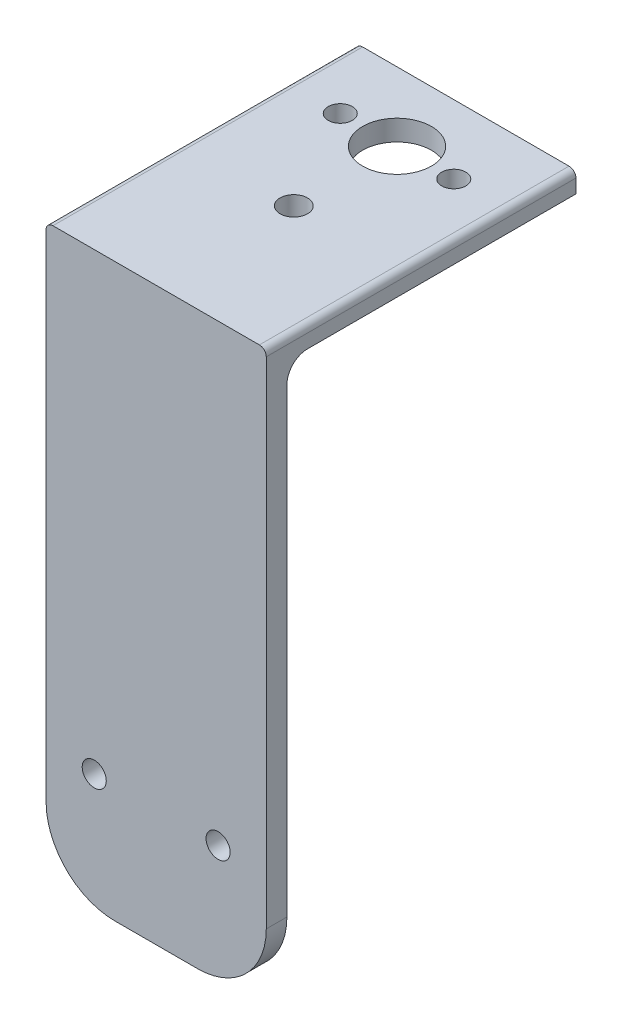
ISO-10303-21;
HEADER;
FILE_DESCRIPTION(('STEP AP214'),'2;1');
FILE_NAME('part.step','',(''),(''),'','','');
FILE_SCHEMA(('AUTOMOTIVE_DESIGN { 1 0 10303 214 1 1 1 1 }'));
ENDSEC;
DATA;
#1=APPLICATION_CONTEXT('core data for automotive mechanical design processes');
#2=APPLICATION_PROTOCOL_DEFINITION('international standard','automotive_design',2000,#1);
#3=PRODUCT_CONTEXT('',#1,'mechanical');
#4=PRODUCT('Part','Part','',(#3));
#5=PRODUCT_RELATED_PRODUCT_CATEGORY('part','',(#4));
#6=PRODUCT_DEFINITION_FORMATION('','',#4);
#7=PRODUCT_DEFINITION_CONTEXT('part definition',#1,'design');
#8=PRODUCT_DEFINITION('design','',#6,#7);
#9=PRODUCT_DEFINITION_SHAPE('','',#8);
#10=(LENGTH_UNIT() NAMED_UNIT(*) SI_UNIT(.MILLI.,.METRE.));
#11=(NAMED_UNIT(*) PLANE_ANGLE_UNIT() SI_UNIT($,.RADIAN.));
#12=(NAMED_UNIT(*) SI_UNIT($,.STERADIAN.) SOLID_ANGLE_UNIT());
#13=UNCERTAINTY_MEASURE_WITH_UNIT(LENGTH_MEASURE(1.E-05),#10,'distance_accuracy_value','');
#14=(GEOMETRIC_REPRESENTATION_CONTEXT(3) GLOBAL_UNCERTAINTY_ASSIGNED_CONTEXT((#13)) GLOBAL_UNIT_ASSIGNED_CONTEXT((#10,
#11,#12)) REPRESENTATION_CONTEXT('',''));
#15=CARTESIAN_POINT('',(0.,0.,0.));
#16=DIRECTION('',(0.,0.,1.));
#17=DIRECTION('',(1.,0.,0.));
#18=AXIS2_PLACEMENT_3D('',#15,#16,#17);
#19=CARTESIAN_POINT('',(0.,3.,0.));
#20=DIRECTION('',(0.,-1.,0.));
#21=DIRECTION('',(0.,0.,-1.));
#22=AXIS2_PLACEMENT_3D('',#19,#20,#21);
#23=PLANE('',#22);
#24=CARTESIAN_POINT('',(0.,3.,2.5));
#25=DIRECTION('',(0.,1.,0.));
#26=DIRECTION('',(0.,0.,1.));
#27=AXIS2_PLACEMENT_3D('',#24,#25,#26);
#28=CIRCLE('',#27,2.);
#29=CARTESIAN_POINT('',(0.,3.,4.5));
#30=VERTEX_POINT('',#29);
#31=EDGE_CURVE('E309',#30,#30,#28,.T.);
#32=ORIENTED_EDGE('',*,*,#31,.F.);
#33=EDGE_LOOP('',(#32));
#34=FACE_BOUND('',#33,.T.);
#35=CARTESIAN_POINT('',(8.25,3.,-12.5));
#36=DIRECTION('',(0.,1.,0.));
#37=DIRECTION('',(0.,0.,1.));
#38=AXIS2_PLACEMENT_3D('',#35,#36,#37);
#39=CIRCLE('',#38,1.75);
#40=CARTESIAN_POINT('',(8.25,3.,-10.75));
#41=VERTEX_POINT('',#40);
#42=EDGE_CURVE('E217',#41,#41,#39,.T.);
#43=ORIENTED_EDGE('',*,*,#42,.F.);
#44=EDGE_LOOP('',(#43));
#45=FACE_BOUND('',#44,.T.);
#46=CARTESIAN_POINT('',(-8.25,3.,-12.5));
#47=DIRECTION('',(0.,1.,0.));
#48=DIRECTION('',(0.,0.,1.));
#49=AXIS2_PLACEMENT_3D('',#46,#47,#48);
#50=CIRCLE('',#49,1.75);
#51=CARTESIAN_POINT('',(-8.25,3.,-10.75));
#52=VERTEX_POINT('',#51);
#53=EDGE_CURVE('E231',#52,#52,#50,.T.);
#54=ORIENTED_EDGE('',*,*,#53,.F.);
#55=EDGE_LOOP('',(#54));
#56=FACE_BOUND('',#55,.T.);
#57=DIRECTION('',(-1.,0.,0.));
#58=VECTOR('',#57,1.);
#59=CARTESIAN_POINT('',(-16.,3.,-22.5));
#60=LINE('',#59,#58);
#61=CARTESIAN_POINT('',(15.,3.,-22.5));
#62=VERTEX_POINT('',#61);
#63=CARTESIAN_POINT('',(-15.,3.,-22.5));
#64=VERTEX_POINT('',#63);
#65=EDGE_CURVE('E160',#62,#64,#60,.T.);
#66=ORIENTED_EDGE('',*,*,#65,.T.);
#67=DIRECTION('',(0.,0.,1.));
#68=VECTOR('',#67,1.);
#69=CARTESIAN_POINT('',(-15.,3.,0.));
#70=LINE('',#69,#68);
#71=CARTESIAN_POINT('',(-15.,3.,22.5));
#72=VERTEX_POINT('',#71);
#73=EDGE_CURVE('E190',#64,#72,#70,.T.);
#74=ORIENTED_EDGE('',*,*,#73,.T.);
#75=DIRECTION('',(1.,0.,0.));
#76=VECTOR('',#75,1.);
#77=CARTESIAN_POINT('',(-16.,3.,22.5));
#78=LINE('',#77,#76);
#79=CARTESIAN_POINT('',(15.,3.,22.5));
#80=VERTEX_POINT('',#79);
#81=EDGE_CURVE('E168',#72,#80,#78,.T.);
#82=ORIENTED_EDGE('',*,*,#81,.T.);
#83=DIRECTION('',(0.,0.,-1.));
#84=VECTOR('',#83,1.);
#85=CARTESIAN_POINT('',(15.,3.,0.));
#86=LINE('',#85,#84);
#87=EDGE_CURVE('E186',#80,#62,#86,.T.);
#88=ORIENTED_EDGE('',*,*,#87,.T.);
#89=EDGE_LOOP('',(#66,#74,#82,#88));
#90=FACE_BOUND('',#89,.T.);
#91=CARTESIAN_POINT('',(0.,3.,-12.5));
#92=DIRECTION('',(0.,1.,0.));
#93=DIRECTION('',(0.,0.,1.));
#94=AXIS2_PLACEMENT_3D('',#91,#92,#93);
#95=CIRCLE('',#94,5.);
#96=CARTESIAN_POINT('',(0.,3.,-7.5));
#97=VERTEX_POINT('',#96);
#98=EDGE_CURVE('E151',#97,#97,#95,.T.);
#99=ORIENTED_EDGE('',*,*,#98,.F.);
#100=EDGE_LOOP('',(#99));
#101=FACE_BOUND('',#100,.T.);
#102=ADVANCED_FACE('F44',(#34,#45,#56,#90,#101),#23,.F.);
#103=CARTESIAN_POINT('',(0.,0.,0.));
#104=DIRECTION('',(0.,-1.,0.));
#105=DIRECTION('',(0.,0.,-1.));
#106=AXIS2_PLACEMENT_3D('',#103,#104,#105);
#107=PLANE('',#106);
#108=CARTESIAN_POINT('',(0.,0.,2.5));
#109=DIRECTION('',(0.,-1.,0.));
#110=DIRECTION('',(0.,0.,-1.));
#111=AXIS2_PLACEMENT_3D('',#108,#109,#110);
#112=CIRCLE('',#111,2.);
#113=CARTESIAN_POINT('',(0.,0.,0.5));
#114=VERTEX_POINT('',#113);
#115=EDGE_CURVE('E48',#114,#114,#112,.T.);
#116=ORIENTED_EDGE('',*,*,#115,.F.);
#117=EDGE_LOOP('',(#116));
#118=FACE_BOUND('',#117,.T.);
#119=CARTESIAN_POINT('',(8.25,0.,-12.5));
#120=DIRECTION('',(0.,-1.,0.));
#121=DIRECTION('',(0.,0.,-1.));
#122=AXIS2_PLACEMENT_3D('',#119,#120,#121);
#123=CIRCLE('',#122,1.75);
#124=CARTESIAN_POINT('',(8.25,0.,-14.25));
#125=VERTEX_POINT('',#124);
#126=EDGE_CURVE('E216',#125,#125,#123,.T.);
#127=ORIENTED_EDGE('',*,*,#126,.F.);
#128=EDGE_LOOP('',(#127));
#129=FACE_BOUND('',#128,.T.);
#130=CARTESIAN_POINT('',(-8.25,0.,-12.5));
#131=DIRECTION('',(0.,-1.,0.));
#132=DIRECTION('',(0.,0.,-1.));
#133=AXIS2_PLACEMENT_3D('',#130,#131,#132);
#134=CIRCLE('',#133,1.75);
#135=CARTESIAN_POINT('',(-8.25,0.,-14.25));
#136=VERTEX_POINT('',#135);
#137=EDGE_CURVE('E212',#136,#136,#134,.T.);
#138=ORIENTED_EDGE('',*,*,#137,.F.);
#139=EDGE_LOOP('',(#138));
#140=FACE_BOUND('',#139,.T.);
#141=DIRECTION('',(0.,0.,-1.));
#142=VECTOR('',#141,1.);
#143=CARTESIAN_POINT('',(16.,0.,22.5));
#144=LINE('',#143,#142);
#145=CARTESIAN_POINT('',(16.,0.,16.5));
#146=VERTEX_POINT('',#145);
#147=CARTESIAN_POINT('',(16.,0.,-22.5));
#148=VERTEX_POINT('',#147);
#149=EDGE_CURVE('E144',#146,#148,#144,.T.);
#150=ORIENTED_EDGE('',*,*,#149,.F.);
#151=DIRECTION('',(1.,0.,0.));
#152=VECTOR('',#151,1.);
#153=CARTESIAN_POINT('',(0.,0.,16.5));
#154=LINE('',#153,#152);
#155=CARTESIAN_POINT('',(-16.,0.,16.5));
#156=VERTEX_POINT('',#155);
#157=EDGE_CURVE('E177',#146,#156,#154,.F.);
#158=ORIENTED_EDGE('',*,*,#157,.T.);
#159=DIRECTION('',(0.,0.,1.));
#160=VECTOR('',#159,1.);
#161=CARTESIAN_POINT('',(-16.,0.,22.5));
#162=LINE('',#161,#160);
#163=CARTESIAN_POINT('',(-16.,0.,-22.5));
#164=VERTEX_POINT('',#163);
#165=EDGE_CURVE('E156',#164,#156,#162,.T.);
#166=ORIENTED_EDGE('',*,*,#165,.F.);
#167=DIRECTION('',(-1.,0.,0.));
#168=VECTOR('',#167,1.);
#169=CARTESIAN_POINT('',(-16.,0.,-22.5));
#170=LINE('',#169,#168);
#171=EDGE_CURVE('E134',#148,#164,#170,.T.);
#172=ORIENTED_EDGE('',*,*,#171,.F.);
#173=EDGE_LOOP('',(#150,#158,#166,#172));
#174=FACE_BOUND('',#173,.T.);
#175=CARTESIAN_POINT('',(0.,0.,-12.5));
#176=DIRECTION('',(0.,1.,0.));
#177=DIRECTION('',(0.,0.,1.));
#178=AXIS2_PLACEMENT_3D('',#175,#176,#177);
#179=CIRCLE('',#178,5.);
#180=CARTESIAN_POINT('',(0.,0.,-7.5));
#181=VERTEX_POINT('',#180);
#182=EDGE_CURVE('E282',#181,#181,#179,.T.);
#183=ORIENTED_EDGE('',*,*,#182,.T.);
#184=EDGE_LOOP('',(#183));
#185=FACE_BOUND('',#184,.T.);
#186=ADVANCED_FACE('F153',(#118,#129,#140,#174,#185),#107,.T.);
#187=CARTESIAN_POINT('',(16.,3.,22.5));
#188=DIRECTION('',(-1.,0.,0.));
#189=DIRECTION('',(0.,0.,1.));
#190=AXIS2_PLACEMENT_3D('',#187,#188,#189);
#191=PLANE('',#190);
#192=DIRECTION('',(0.,-1.,0.));
#193=VECTOR('',#192,1.);
#194=CARTESIAN_POINT('',(16.,3.,22.5));
#195=LINE('',#194,#193);
#196=CARTESIAN_POINT('',(16.,2.,22.5));
#197=VERTEX_POINT('',#196);
#198=CARTESIAN_POINT('',(16.,-70.,22.5));
#199=VERTEX_POINT('',#198);
#200=EDGE_CURVE('E164',#197,#199,#195,.T.);
#201=ORIENTED_EDGE('',*,*,#200,.T.);
#202=DIRECTION('',(0.,0.,1.));
#203=VECTOR('',#202,1.);
#204=CARTESIAN_POINT('',(16.,-70.,19.5));
#205=LINE('',#204,#203);
#206=CARTESIAN_POINT('',(16.,-70.,19.5));
#207=VERTEX_POINT('',#206);
#208=EDGE_CURVE('E69',#199,#207,#205,.F.);
#209=ORIENTED_EDGE('',*,*,#208,.T.);
#210=DIRECTION('',(0.,1.,0.));
#211=VECTOR('',#210,1.);
#212=CARTESIAN_POINT('',(16.,-80.,19.5));
#213=LINE('',#212,#211);
#214=CARTESIAN_POINT('',(16.,-3.,19.5));
#215=VERTEX_POINT('',#214);
#216=EDGE_CURVE('E253',#207,#215,#213,.T.);
#217=ORIENTED_EDGE('',*,*,#216,.T.);
#218=CARTESIAN_POINT('',(16.,-3.,16.5));
#219=DIRECTION('',(-1.,0.,0.));
#220=DIRECTION('',(0.,0.,1.));
#221=AXIS2_PLACEMENT_3D('',#218,#219,#220);
#222=CIRCLE('',#221,3.);
#223=EDGE_CURVE('E147',#215,#146,#222,.T.);
#224=ORIENTED_EDGE('',*,*,#223,.T.);
#225=ORIENTED_EDGE('',*,*,#149,.T.);
#226=DIRECTION('',(0.,-1.,0.));
#227=VECTOR('',#226,1.);
#228=CARTESIAN_POINT('',(16.,3.,-22.5));
#229=LINE('',#228,#227);
#230=CARTESIAN_POINT('',(16.,2.,-22.5));
#231=VERTEX_POINT('',#230);
#232=EDGE_CURVE('E129',#231,#148,#229,.T.);
#233=ORIENTED_EDGE('',*,*,#232,.F.);
#234=DIRECTION('',(0.,0.,-1.));
#235=VECTOR('',#234,1.);
#236=CARTESIAN_POINT('',(16.,2.,22.5));
#237=LINE('',#236,#235);
#238=EDGE_CURVE('E208',#231,#197,#237,.F.);
#239=ORIENTED_EDGE('',*,*,#238,.T.);
#240=EDGE_LOOP('',(#201,#209,#217,#224,#225,#233,#239));
#241=FACE_BOUND('',#240,.T.);
#242=ADVANCED_FACE('F145',(#241),#191,.F.);
#243=CARTESIAN_POINT('',(-16.,3.,-22.5));
#244=DIRECTION('',(0.,0.,1.));
#245=DIRECTION('',(1.,0.,0.));
#246=AXIS2_PLACEMENT_3D('',#243,#244,#245);
#247=PLANE('',#246);
#248=DIRECTION('',(0.,-1.,0.));
#249=VECTOR('',#248,1.);
#250=CARTESIAN_POINT('',(-16.,3.,-22.5));
#251=LINE('',#250,#249);
#252=CARTESIAN_POINT('',(-16.,2.,-22.5));
#253=VERTEX_POINT('',#252);
#254=EDGE_CURVE('E141',#253,#164,#251,.T.);
#255=ORIENTED_EDGE('',*,*,#254,.F.);
#256=CARTESIAN_POINT('',(-15.,2.,-22.5));
#257=DIRECTION('',(0.,0.,1.));
#258=DIRECTION('',(1.,0.,0.));
#259=AXIS2_PLACEMENT_3D('',#256,#257,#258);
#260=CIRCLE('',#259,1.);
#261=EDGE_CURVE('E205',#253,#64,#260,.F.);
#262=ORIENTED_EDGE('',*,*,#261,.T.);
#263=ORIENTED_EDGE('',*,*,#65,.F.);
#264=CARTESIAN_POINT('',(15.,2.,-22.5));
#265=DIRECTION('',(0.,0.,1.));
#266=DIRECTION('',(1.,0.,0.));
#267=AXIS2_PLACEMENT_3D('',#264,#265,#266);
#268=CIRCLE('',#267,1.);
#269=EDGE_CURVE('E137',#62,#231,#268,.F.);
#270=ORIENTED_EDGE('',*,*,#269,.T.);
#271=ORIENTED_EDGE('',*,*,#232,.T.);
#272=ORIENTED_EDGE('',*,*,#171,.T.);
#273=EDGE_LOOP('',(#255,#262,#263,#270,#271,#272));
#274=FACE_BOUND('',#273,.T.);
#275=ADVANCED_FACE('F132',(#274),#247,.F.);
#276=CARTESIAN_POINT('',(-16.,3.,22.5));
#277=DIRECTION('',(1.,0.,0.));
#278=DIRECTION('',(0.,0.,-1.));
#279=AXIS2_PLACEMENT_3D('',#276,#277,#278);
#280=PLANE('',#279);
#281=DIRECTION('',(0.,1.,0.));
#282=VECTOR('',#281,1.);
#283=CARTESIAN_POINT('',(-16.,-80.,19.5));
#284=LINE('',#283,#282);
#285=CARTESIAN_POINT('',(-16.,-70.,19.5));
#286=VERTEX_POINT('',#285);
#287=CARTESIAN_POINT('',(-16.,-3.,19.5));
#288=VERTEX_POINT('',#287);
#289=EDGE_CURVE('E286',#286,#288,#284,.T.);
#290=ORIENTED_EDGE('',*,*,#289,.F.);
#291=DIRECTION('',(0.,0.,-1.));
#292=VECTOR('',#291,1.);
#293=CARTESIAN_POINT('',(-16.,-70.,22.5));
#294=LINE('',#293,#292);
#295=CARTESIAN_POINT('',(-16.,-70.,22.5));
#296=VERTEX_POINT('',#295);
#297=EDGE_CURVE('E11',#286,#296,#294,.F.);
#298=ORIENTED_EDGE('',*,*,#297,.T.);
#299=DIRECTION('',(0.,-1.,0.));
#300=VECTOR('',#299,1.);
#301=CARTESIAN_POINT('',(-16.,3.,22.5));
#302=LINE('',#301,#300);
#303=CARTESIAN_POINT('',(-16.,2.,22.5));
#304=VERTEX_POINT('',#303);
#305=EDGE_CURVE('E167',#304,#296,#302,.T.);
#306=ORIENTED_EDGE('',*,*,#305,.F.);
#307=DIRECTION('',(0.,0.,1.));
#308=VECTOR('',#307,1.);
#309=CARTESIAN_POINT('',(-16.,2.,22.5));
#310=LINE('',#309,#308);
#311=EDGE_CURVE('E200',#304,#253,#310,.F.);
#312=ORIENTED_EDGE('',*,*,#311,.T.);
#313=ORIENTED_EDGE('',*,*,#254,.T.);
#314=ORIENTED_EDGE('',*,*,#165,.T.);
#315=CARTESIAN_POINT('',(-16.,-3.,16.5));
#316=DIRECTION('',(1.,0.,0.));
#317=DIRECTION('',(0.,0.,-1.));
#318=AXIS2_PLACEMENT_3D('',#315,#316,#317);
#319=CIRCLE('',#318,3.);
#320=EDGE_CURVE('E182',#156,#288,#319,.T.);
#321=ORIENTED_EDGE('',*,*,#320,.T.);
#322=EDGE_LOOP('',(#290,#298,#306,#312,#313,#314,#321));
#323=FACE_BOUND('',#322,.T.);
#324=ADVANCED_FACE('F347',(#323),#280,.F.);
#325=CARTESIAN_POINT('',(-16.,3.,22.5));
#326=DIRECTION('',(0.,0.,-1.));
#327=DIRECTION('',(-1.,0.,0.));
#328=AXIS2_PLACEMENT_3D('',#325,#326,#327);
#329=PLANE('',#328);
#330=CARTESIAN_POINT('',(-9.,-63.,22.5));
#331=DIRECTION('',(0.,0.,1.));
#332=DIRECTION('',(1.,0.,0.));
#333=AXIS2_PLACEMENT_3D('',#330,#331,#332);
#334=CIRCLE('',#333,1.75);
#335=CARTESIAN_POINT('',(-7.25,-63.,22.5));
#336=VERTEX_POINT('',#335);
#337=EDGE_CURVE('E227',#336,#336,#334,.T.);
#338=ORIENTED_EDGE('',*,*,#337,.F.);
#339=EDGE_LOOP('',(#338));
#340=FACE_BOUND('',#339,.T.);
#341=CARTESIAN_POINT('',(9.,-63.,22.5));
#342=DIRECTION('',(0.,0.,1.));
#343=DIRECTION('',(1.,0.,0.));
#344=AXIS2_PLACEMENT_3D('',#341,#342,#343);
#345=CIRCLE('',#344,1.75);
#346=CARTESIAN_POINT('',(10.75,-63.,22.5));
#347=VERTEX_POINT('',#346);
#348=EDGE_CURVE('E302',#347,#347,#345,.T.);
#349=ORIENTED_EDGE('',*,*,#348,.F.);
#350=EDGE_LOOP('',(#349));
#351=FACE_BOUND('',#350,.T.);
#352=DIRECTION('',(-1.,0.,0.));
#353=VECTOR('',#352,1.);
#354=CARTESIAN_POINT('',(-16.,-80.,22.5));
#355=LINE('',#354,#353);
#356=CARTESIAN_POINT('',(6.,-80.,22.5));
#357=VERTEX_POINT('',#356);
#358=CARTESIAN_POINT('',(-6.,-80.,22.5));
#359=VERTEX_POINT('',#358);
#360=EDGE_CURVE('E262',#357,#359,#355,.T.);
#361=ORIENTED_EDGE('',*,*,#360,.F.);
#362=CARTESIAN_POINT('',(6.,-70.,22.5));
#363=DIRECTION('',(0.,0.,-1.));
#364=DIRECTION('',(-1.,0.,0.));
#365=AXIS2_PLACEMENT_3D('',#362,#363,#364);
#366=CIRCLE('',#365,10.);
#367=EDGE_CURVE('E242',#357,#199,#366,.F.);
#368=ORIENTED_EDGE('',*,*,#367,.T.);
#369=ORIENTED_EDGE('',*,*,#200,.F.);
#370=CARTESIAN_POINT('',(15.,2.,22.5));
#371=DIRECTION('',(0.,0.,-1.));
#372=DIRECTION('',(-1.,0.,0.));
#373=AXIS2_PLACEMENT_3D('',#370,#371,#372);
#374=CIRCLE('',#373,1.);
#375=EDGE_CURVE('E194',#197,#80,#374,.F.);
#376=ORIENTED_EDGE('',*,*,#375,.T.);
#377=ORIENTED_EDGE('',*,*,#81,.F.);
#378=CARTESIAN_POINT('',(-15.,2.,22.5));
#379=DIRECTION('',(0.,0.,-1.));
#380=DIRECTION('',(-1.,0.,0.));
#381=AXIS2_PLACEMENT_3D('',#378,#379,#380);
#382=CIRCLE('',#381,1.);
#383=EDGE_CURVE('E197',#72,#304,#382,.F.);
#384=ORIENTED_EDGE('',*,*,#383,.T.);
#385=ORIENTED_EDGE('',*,*,#305,.T.);
#386=CARTESIAN_POINT('',(-6.,-70.,22.5));
#387=DIRECTION('',(0.,0.,-1.));
#388=DIRECTION('',(-1.,0.,0.));
#389=AXIS2_PLACEMENT_3D('',#386,#387,#388);
#390=CIRCLE('',#389,10.);
#391=EDGE_CURVE('E239',#296,#359,#390,.F.);
#392=ORIENTED_EDGE('',*,*,#391,.T.);
#393=EDGE_LOOP('',(#361,#368,#369,#376,#377,#384,#385,#392));
#394=FACE_BOUND('',#393,.T.);
#395=ADVANCED_FACE('F267',(#340,#351,#394),#329,.F.);
#396=CARTESIAN_POINT('',(0.,3.,-12.5));
#397=DIRECTION('',(0.,-1.,0.));
#398=DIRECTION('',(0.,0.,-1.));
#399=AXIS2_PLACEMENT_3D('',#396,#397,#398);
#400=CYLINDRICAL_SURFACE('',#399,5.);
#401=ORIENTED_EDGE('',*,*,#98,.T.);
#402=EDGE_LOOP('',(#401));
#403=FACE_BOUND('',#402,.T.);
#404=ORIENTED_EDGE('',*,*,#182,.F.);
#405=EDGE_LOOP('',(#404));
#406=FACE_BOUND('',#405,.T.);
#407=ADVANCED_FACE('F342',(#403,#406),#400,.F.);
#408=CARTESIAN_POINT('',(-16.,-80.,19.5));
#409=DIRECTION('',(0.,0.,1.));
#410=DIRECTION('',(1.,0.,0.));
#411=AXIS2_PLACEMENT_3D('',#408,#409,#410);
#412=PLANE('',#411);
#413=CARTESIAN_POINT('',(-9.,-63.,19.5));
#414=DIRECTION('',(0.,0.,1.));
#415=DIRECTION('',(1.,0.,0.));
#416=AXIS2_PLACEMENT_3D('',#413,#414,#415);
#417=CIRCLE('',#416,1.75);
#418=CARTESIAN_POINT('',(-7.25,-63.,19.5));
#419=VERTEX_POINT('',#418);
#420=EDGE_CURVE('E226',#419,#419,#417,.T.);
#421=ORIENTED_EDGE('',*,*,#420,.T.);
#422=EDGE_LOOP('',(#421));
#423=FACE_BOUND('',#422,.T.);
#424=CARTESIAN_POINT('',(9.,-63.,19.5));
#425=DIRECTION('',(0.,0.,1.));
#426=DIRECTION('',(1.,0.,0.));
#427=AXIS2_PLACEMENT_3D('',#424,#425,#426);
#428=CIRCLE('',#427,1.75);
#429=CARTESIAN_POINT('',(10.75,-63.,19.5));
#430=VERTEX_POINT('',#429);
#431=EDGE_CURVE('E222',#430,#430,#428,.T.);
#432=ORIENTED_EDGE('',*,*,#431,.T.);
#433=EDGE_LOOP('',(#432));
#434=FACE_BOUND('',#433,.T.);
#435=ORIENTED_EDGE('',*,*,#216,.F.);
#436=CARTESIAN_POINT('',(6.,-70.,19.5));
#437=DIRECTION('',(0.,0.,1.));
#438=DIRECTION('',(1.,0.,0.));
#439=AXIS2_PLACEMENT_3D('',#436,#437,#438);
#440=CIRCLE('',#439,10.);
#441=CARTESIAN_POINT('',(6.,-80.,19.5));
#442=VERTEX_POINT('',#441);
#443=EDGE_CURVE('E54',#207,#442,#440,.F.);
#444=ORIENTED_EDGE('',*,*,#443,.T.);
#445=DIRECTION('',(1.,0.,0.));
#446=VECTOR('',#445,1.);
#447=CARTESIAN_POINT('',(-16.,-80.,19.5));
#448=LINE('',#447,#446);
#449=CARTESIAN_POINT('',(-6.,-80.,19.5));
#450=VERTEX_POINT('',#449);
#451=EDGE_CURVE('E221',#450,#442,#448,.T.);
#452=ORIENTED_EDGE('',*,*,#451,.F.);
#453=CARTESIAN_POINT('',(-6.,-70.,19.5));
#454=DIRECTION('',(0.,0.,1.));
#455=DIRECTION('',(1.,0.,0.));
#456=AXIS2_PLACEMENT_3D('',#453,#454,#455);
#457=CIRCLE('',#456,10.);
#458=EDGE_CURVE('E61',#450,#286,#457,.F.);
#459=ORIENTED_EDGE('',*,*,#458,.T.);
#460=ORIENTED_EDGE('',*,*,#289,.T.);
#461=DIRECTION('',(1.,0.,0.));
#462=VECTOR('',#461,1.);
#463=CARTESIAN_POINT('',(-16.,-3.,19.5));
#464=LINE('',#463,#462);
#465=EDGE_CURVE('E140',#288,#215,#464,.T.);
#466=ORIENTED_EDGE('',*,*,#465,.T.);
#467=EDGE_LOOP('',(#435,#444,#452,#459,#460,#466));
#468=FACE_BOUND('',#467,.T.);
#469=ADVANCED_FACE('F252',(#423,#434,#468),#412,.F.);
#470=CARTESIAN_POINT('',(0.,-80.,0.));
#471=DIRECTION('',(0.,-1.,0.));
#472=DIRECTION('',(0.,0.,-1.));
#473=AXIS2_PLACEMENT_3D('',#470,#471,#472);
#474=PLANE('',#473);
#475=ORIENTED_EDGE('',*,*,#451,.T.);
#476=DIRECTION('',(0.,0.,1.));
#477=VECTOR('',#476,1.);
#478=CARTESIAN_POINT('',(6.,-80.,22.5));
#479=LINE('',#478,#477);
#480=EDGE_CURVE('E235',#442,#357,#479,.T.);
#481=ORIENTED_EDGE('',*,*,#480,.T.);
#482=ORIENTED_EDGE('',*,*,#360,.T.);
#483=DIRECTION('',(0.,0.,-1.));
#484=VECTOR('',#483,1.);
#485=CARTESIAN_POINT('',(-6.,-80.,19.5));
#486=LINE('',#485,#484);
#487=EDGE_CURVE('E211',#359,#450,#486,.T.);
#488=ORIENTED_EDGE('',*,*,#487,.T.);
#489=EDGE_LOOP('',(#475,#481,#482,#488));
#490=FACE_BOUND('',#489,.T.);
#491=ADVANCED_FACE('F257',(#490),#474,.T.);
#492=CARTESIAN_POINT('',(-16.,-3.,16.5));
#493=DIRECTION('',(1.,0.,0.));
#494=DIRECTION('',(0.,0.,-1.));
#495=AXIS2_PLACEMENT_3D('',#492,#493,#494);
#496=CYLINDRICAL_SURFACE('',#495,3.);
#497=ORIENTED_EDGE('',*,*,#320,.F.);
#498=ORIENTED_EDGE('',*,*,#157,.F.);
#499=ORIENTED_EDGE('',*,*,#223,.F.);
#500=ORIENTED_EDGE('',*,*,#465,.F.);
#501=EDGE_LOOP('',(#497,#498,#499,#500));
#502=FACE_BOUND('',#501,.T.);
#503=ADVANCED_FACE('F356',(#502),#496,.F.);
#504=CARTESIAN_POINT('',(-15.,2.,0.));
#505=DIRECTION('',(0.,0.,1.));
#506=DIRECTION('',(1.,0.,0.));
#507=AXIS2_PLACEMENT_3D('',#504,#505,#506);
#508=CYLINDRICAL_SURFACE('',#507,1.);
#509=ORIENTED_EDGE('',*,*,#261,.F.);
#510=ORIENTED_EDGE('',*,*,#311,.F.);
#511=ORIENTED_EDGE('',*,*,#383,.F.);
#512=ORIENTED_EDGE('',*,*,#73,.F.);
#513=EDGE_LOOP('',(#509,#510,#511,#512));
#514=FACE_BOUND('',#513,.T.);
#515=ADVANCED_FACE('F359',(#514),#508,.T.);
#516=CARTESIAN_POINT('',(15.,2.,0.));
#517=DIRECTION('',(0.,0.,-1.));
#518=DIRECTION('',(-1.,0.,0.));
#519=AXIS2_PLACEMENT_3D('',#516,#517,#518);
#520=CYLINDRICAL_SURFACE('',#519,1.);
#521=ORIENTED_EDGE('',*,*,#375,.F.);
#522=ORIENTED_EDGE('',*,*,#238,.F.);
#523=ORIENTED_EDGE('',*,*,#269,.F.);
#524=ORIENTED_EDGE('',*,*,#87,.F.);
#525=EDGE_LOOP('',(#521,#522,#523,#524));
#526=FACE_BOUND('',#525,.T.);
#527=ADVANCED_FACE('F270',(#526),#520,.T.);
#528=CARTESIAN_POINT('',(-8.25,-7.,-12.5));
#529=DIRECTION('',(0.,1.,0.));
#530=DIRECTION('',(0.,0.,1.));
#531=AXIS2_PLACEMENT_3D('',#528,#529,#530);
#532=CYLINDRICAL_SURFACE('',#531,1.75);
#533=ORIENTED_EDGE('',*,*,#137,.T.);
#534=EDGE_LOOP('',(#533));
#535=FACE_BOUND('',#534,.T.);
#536=ORIENTED_EDGE('',*,*,#53,.T.);
#537=EDGE_LOOP('',(#536));
#538=FACE_BOUND('',#537,.T.);
#539=ADVANCED_FACE('F327',(#535,#538),#532,.F.);
#540=CARTESIAN_POINT('',(8.25,-7.,-12.5));
#541=DIRECTION('',(0.,1.,0.));
#542=DIRECTION('',(0.,0.,1.));
#543=AXIS2_PLACEMENT_3D('',#540,#541,#542);
#544=CYLINDRICAL_SURFACE('',#543,1.75);
#545=ORIENTED_EDGE('',*,*,#126,.T.);
#546=EDGE_LOOP('',(#545));
#547=FACE_BOUND('',#546,.T.);
#548=ORIENTED_EDGE('',*,*,#42,.T.);
#549=EDGE_LOOP('',(#548));
#550=FACE_BOUND('',#549,.T.);
#551=ADVANCED_FACE('F330',(#547,#550),#544,.F.);
#552=CARTESIAN_POINT('',(9.,-63.,12.5));
#553=DIRECTION('',(0.,0.,1.));
#554=DIRECTION('',(1.,0.,0.));
#555=AXIS2_PLACEMENT_3D('',#552,#553,#554);
#556=CYLINDRICAL_SURFACE('',#555,1.75);
#557=ORIENTED_EDGE('',*,*,#348,.T.);
#558=EDGE_LOOP('',(#557));
#559=FACE_BOUND('',#558,.T.);
#560=ORIENTED_EDGE('',*,*,#431,.F.);
#561=EDGE_LOOP('',(#560));
#562=FACE_BOUND('',#561,.T.);
#563=ADVANCED_FACE('F372',(#559,#562),#556,.F.);
#564=CARTESIAN_POINT('',(-9.,-63.,12.5));
#565=DIRECTION('',(0.,0.,1.));
#566=DIRECTION('',(1.,0.,0.));
#567=AXIS2_PLACEMENT_3D('',#564,#565,#566);
#568=CYLINDRICAL_SURFACE('',#567,1.75);
#569=ORIENTED_EDGE('',*,*,#337,.T.);
#570=EDGE_LOOP('',(#569));
#571=FACE_BOUND('',#570,.T.);
#572=ORIENTED_EDGE('',*,*,#420,.F.);
#573=EDGE_LOOP('',(#572));
#574=FACE_BOUND('',#573,.T.);
#575=ADVANCED_FACE('F366',(#571,#574),#568,.F.);
#576=CARTESIAN_POINT('',(6.,-70.,0.));
#577=DIRECTION('',(0.,0.,-1.));
#578=DIRECTION('',(-1.,0.,0.));
#579=AXIS2_PLACEMENT_3D('',#576,#577,#578);
#580=CYLINDRICAL_SURFACE('',#579,10.);
#581=ORIENTED_EDGE('',*,*,#443,.F.);
#582=ORIENTED_EDGE('',*,*,#208,.F.);
#583=ORIENTED_EDGE('',*,*,#367,.F.);
#584=ORIENTED_EDGE('',*,*,#480,.F.);
#585=EDGE_LOOP('',(#581,#582,#583,#584));
#586=FACE_BOUND('',#585,.T.);
#587=ADVANCED_FACE('F264',(#586),#580,.T.);
#588=CARTESIAN_POINT('',(-6.,-70.,0.));
#589=DIRECTION('',(0.,0.,1.));
#590=DIRECTION('',(1.,0.,0.));
#591=AXIS2_PLACEMENT_3D('',#588,#589,#590);
#592=CYLINDRICAL_SURFACE('',#591,10.);
#593=ORIENTED_EDGE('',*,*,#391,.F.);
#594=ORIENTED_EDGE('',*,*,#297,.F.);
#595=ORIENTED_EDGE('',*,*,#458,.F.);
#596=ORIENTED_EDGE('',*,*,#487,.F.);
#597=EDGE_LOOP('',(#593,#594,#595,#596));
#598=FACE_BOUND('',#597,.T.);
#599=ADVANCED_FACE('F46',(#598),#592,.T.);
#600=CARTESIAN_POINT('',(0.,-7.,2.5));
#601=DIRECTION('',(0.,1.,0.));
#602=DIRECTION('',(0.,0.,1.));
#603=AXIS2_PLACEMENT_3D('',#600,#601,#602);
#604=CYLINDRICAL_SURFACE('',#603,2.);
#605=ORIENTED_EDGE('',*,*,#115,.T.);
#606=EDGE_LOOP('',(#605));
#607=FACE_BOUND('',#606,.T.);
#608=ORIENTED_EDGE('',*,*,#31,.T.);
#609=EDGE_LOOP('',(#608));
#610=FACE_BOUND('',#609,.T.);
#611=ADVANCED_FACE('F318',(#607,#610),#604,.F.);
#612=CLOSED_SHELL('',(#102,#186,#242,#275,#324,#395,#407,#469,#491,#503,#515,#527,#539,#551,
#563,#575,#587,#599,#611));
#613=MANIFOLD_SOLID_BREP('B2',#612);
#614=ADVANCED_BREP_SHAPE_REPRESENTATION('',(#18,#613),#14);
#615=SHAPE_DEFINITION_REPRESENTATION(#9,#614);
ENDSEC;
END-ISO-10303-21;
